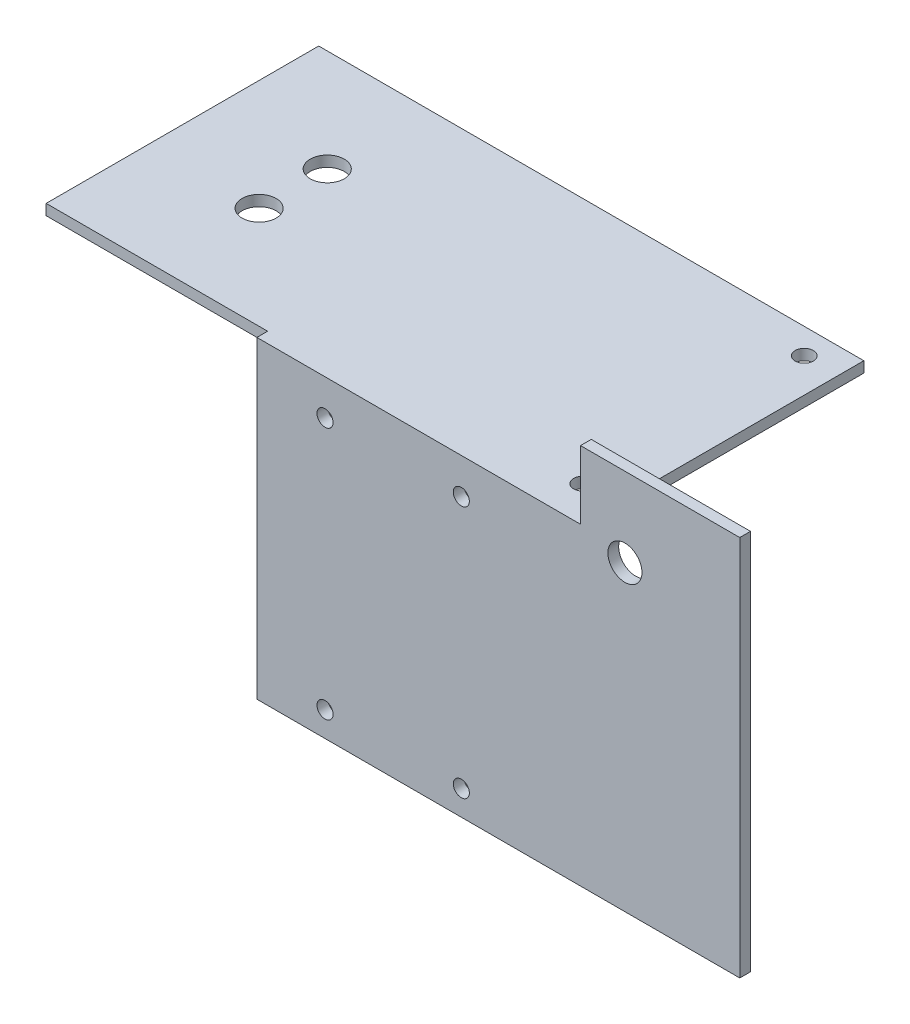
ISO-10303-21;
HEADER;
FILE_DESCRIPTION(('STEP AP214'),'2;1');
FILE_NAME('part.step','',(''),(''),'','','');
FILE_SCHEMA(('AUTOMOTIVE_DESIGN { 1 0 10303 214 1 1 1 1 }'));
ENDSEC;
DATA;
#1=APPLICATION_CONTEXT('core data for automotive mechanical design processes');
#2=APPLICATION_PROTOCOL_DEFINITION('international standard','automotive_design',2000,#1);
#3=PRODUCT_CONTEXT('',#1,'mechanical');
#4=PRODUCT('Part','Part','',(#3));
#5=PRODUCT_RELATED_PRODUCT_CATEGORY('part','',(#4));
#6=PRODUCT_DEFINITION_FORMATION('','',#4);
#7=PRODUCT_DEFINITION_CONTEXT('part definition',#1,'design');
#8=PRODUCT_DEFINITION('design','',#6,#7);
#9=PRODUCT_DEFINITION_SHAPE('','',#8);
#10=(LENGTH_UNIT() NAMED_UNIT(*) SI_UNIT(.MILLI.,.METRE.));
#11=(NAMED_UNIT(*) PLANE_ANGLE_UNIT() SI_UNIT($,.RADIAN.));
#12=(NAMED_UNIT(*) SI_UNIT($,.STERADIAN.) SOLID_ANGLE_UNIT());
#13=UNCERTAINTY_MEASURE_WITH_UNIT(LENGTH_MEASURE(1.E-05),#10,'distance_accuracy_value','');
#14=(GEOMETRIC_REPRESENTATION_CONTEXT(3) GLOBAL_UNCERTAINTY_ASSIGNED_CONTEXT((#13)) GLOBAL_UNIT_ASSIGNED_CONTEXT((#10,
#11,#12)) REPRESENTATION_CONTEXT('',''));
#15=CARTESIAN_POINT('',(0.,0.,0.));
#16=DIRECTION('',(0.,0.,1.));
#17=DIRECTION('',(1.,0.,0.));
#18=AXIS2_PLACEMENT_3D('',#15,#16,#17);
#19=CARTESIAN_POINT('',(0.,0.,-2.));
#20=DIRECTION('',(0.,0.,1.));
#21=DIRECTION('',(1.,0.,0.));
#22=AXIS2_PLACEMENT_3D('',#19,#20,#21);
#23=PLANE('',#22);
#24=CARTESIAN_POINT('',(68.6,56.33204182,-2.));
#25=DIRECTION('',(0.,0.,1.));
#26=DIRECTION('',(1.,0.,0.));
#27=AXIS2_PLACEMENT_3D('',#24,#25,#26);
#28=CIRCLE('',#27,3.175);
#29=CARTESIAN_POINT('',(71.775,56.33204182,-2.));
#30=VERTEX_POINT('',#29);
#31=EDGE_CURVE('E132',#30,#30,#28,.T.);
#32=ORIENTED_EDGE('',*,*,#31,.T.);
#33=EDGE_LOOP('',(#32));
#34=FACE_BOUND('',#33,.T.);
#35=CARTESIAN_POINT('',(12.7,51.75,-2.));
#36=DIRECTION('',(0.,0.,1.));
#37=DIRECTION('',(1.,0.,0.));
#38=AXIS2_PLACEMENT_3D('',#35,#36,#37);
#39=CIRCLE('',#38,1.5);
#40=CARTESIAN_POINT('',(14.2,51.75,-2.));
#41=VERTEX_POINT('',#40);
#42=EDGE_CURVE('E223',#41,#41,#39,.T.);
#43=ORIENTED_EDGE('',*,*,#42,.T.);
#44=EDGE_LOOP('',(#43));
#45=FACE_BOUND('',#44,.T.);
#46=CARTESIAN_POINT('',(38.1,51.75,-2.));
#47=DIRECTION('',(0.,0.,1.));
#48=DIRECTION('',(1.,0.,0.));
#49=AXIS2_PLACEMENT_3D('',#46,#47,#48);
#50=CIRCLE('',#49,1.5);
#51=CARTESIAN_POINT('',(39.6,51.75,-2.));
#52=VERTEX_POINT('',#51);
#53=EDGE_CURVE('E217',#52,#52,#50,.T.);
#54=ORIENTED_EDGE('',*,*,#53,.T.);
#55=EDGE_LOOP('',(#54));
#56=FACE_BOUND('',#55,.T.);
#57=CARTESIAN_POINT('',(12.7,4.64999999999999,-2.));
#58=DIRECTION('',(0.,0.,1.));
#59=DIRECTION('',(1.,0.,0.));
#60=AXIS2_PLACEMENT_3D('',#57,#58,#59);
#61=CIRCLE('',#60,1.5);
#62=CARTESIAN_POINT('',(14.2,4.64999999999999,-2.));
#63=VERTEX_POINT('',#62);
#64=EDGE_CURVE('E211',#63,#63,#61,.T.);
#65=ORIENTED_EDGE('',*,*,#64,.T.);
#66=EDGE_LOOP('',(#65));
#67=FACE_BOUND('',#66,.T.);
#68=CARTESIAN_POINT('',(38.1,4.64999999999999,-2.));
#69=DIRECTION('',(0.,0.,1.));
#70=DIRECTION('',(1.,0.,0.));
#71=AXIS2_PLACEMENT_3D('',#68,#69,#70);
#72=CIRCLE('',#71,1.50000000000002);
#73=CARTESIAN_POINT('',(39.6,4.64999999999999,-2.));
#74=VERTEX_POINT('',#73);
#75=EDGE_CURVE('E205',#74,#74,#72,.T.);
#76=ORIENTED_EDGE('',*,*,#75,.T.);
#77=EDGE_LOOP('',(#76));
#78=FACE_BOUND('',#77,.T.);
#79=DIRECTION('',(-1.,0.,0.));
#80=VECTOR('',#79,1.);
#81=CARTESIAN_POINT('',(0.,56.4,-2.));
#82=LINE('',#81,#80);
#83=CARTESIAN_POINT('',(60.325,56.4,-2.));
#84=VERTEX_POINT('',#83);
#85=CARTESIAN_POINT('',(0.,56.4,-2.));
#86=VERTEX_POINT('',#85);
#87=EDGE_CURVE('E189',#84,#86,#82,.T.);
#88=ORIENTED_EDGE('',*,*,#87,.F.);
#89=DIRECTION('',(0.,-1.,0.));
#90=VECTOR('',#89,1.);
#91=CARTESIAN_POINT('',(60.325,56.4,-2.));
#92=LINE('',#91,#90);
#93=CARTESIAN_POINT('',(60.325,58.4,-2.));
#94=VERTEX_POINT('',#93);
#95=EDGE_CURVE('E117',#94,#84,#92,.T.);
#96=ORIENTED_EDGE('',*,*,#95,.F.);
#97=DIRECTION('',(0.,-1.,0.));
#98=VECTOR('',#97,1.);
#99=CARTESIAN_POINT('',(60.325,58.4,-2.));
#100=LINE('',#99,#98);
#101=CARTESIAN_POINT('',(60.325,71.1,-2.));
#102=VERTEX_POINT('',#101);
#103=EDGE_CURVE('E102',#102,#94,#100,.T.);
#104=ORIENTED_EDGE('',*,*,#103,.F.);
#105=DIRECTION('',(-1.,0.,0.));
#106=VECTOR('',#105,1.);
#107=CARTESIAN_POINT('',(60.325,71.1,-2.));
#108=LINE('',#107,#106);
#109=CARTESIAN_POINT('',(90.,71.1,-2.));
#110=VERTEX_POINT('',#109);
#111=EDGE_CURVE('E114',#110,#102,#108,.T.);
#112=ORIENTED_EDGE('',*,*,#111,.F.);
#113=DIRECTION('',(0.,1.,0.));
#114=VECTOR('',#113,1.);
#115=CARTESIAN_POINT('',(90.,71.1,-2.));
#116=LINE('',#115,#114);
#117=CARTESIAN_POINT('',(90.,0.,-2.));
#118=VERTEX_POINT('',#117);
#119=EDGE_CURVE('E122',#118,#110,#116,.T.);
#120=ORIENTED_EDGE('',*,*,#119,.F.);
#121=DIRECTION('',(1.,0.,0.));
#122=VECTOR('',#121,1.);
#123=CARTESIAN_POINT('',(0.,0.,-2.));
#124=LINE('',#123,#122);
#125=CARTESIAN_POINT('',(0.,0.,-2.));
#126=VERTEX_POINT('',#125);
#127=EDGE_CURVE('E124',#126,#118,#124,.T.);
#128=ORIENTED_EDGE('',*,*,#127,.F.);
#129=DIRECTION('',(0.,-1.,0.));
#130=VECTOR('',#129,1.);
#131=CARTESIAN_POINT('',(0.,58.4,-2.));
#132=LINE('',#131,#130);
#133=EDGE_CURVE('E51',#86,#126,#132,.T.);
#134=ORIENTED_EDGE('',*,*,#133,.F.);
#135=EDGE_LOOP('',(#88,#96,#104,#112,#120,#128,#134));
#136=FACE_BOUND('',#135,.T.);
#137=ADVANCED_FACE('F34',(#34,#45,#56,#67,#78,#136),#23,.F.);
#138=CARTESIAN_POINT('',(0.,58.4,-2.));
#139=DIRECTION('',(-1.,0.,0.));
#140=DIRECTION('',(0.,0.,1.));
#141=AXIS2_PLACEMENT_3D('',#138,#139,#140);
#142=PLANE('',#141);
#143=DIRECTION('',(0.,-1.,0.));
#144=VECTOR('',#143,1.);
#145=CARTESIAN_POINT('',(0.,58.4,0.));
#146=LINE('',#145,#144);
#147=CARTESIAN_POINT('',(0.,58.4,0.));
#148=VERTEX_POINT('',#147);
#149=CARTESIAN_POINT('',(0.,0.,0.));
#150=VERTEX_POINT('',#149);
#151=EDGE_CURVE('E128',#148,#150,#146,.T.);
#152=ORIENTED_EDGE('',*,*,#151,.F.);
#153=DIRECTION('',(0.,0.,1.));
#154=VECTOR('',#153,1.);
#155=CARTESIAN_POINT('',(0.,58.4,-2.));
#156=LINE('',#155,#154);
#157=CARTESIAN_POINT('',(0.,58.4,-2.));
#158=VERTEX_POINT('',#157);
#159=EDGE_CURVE('E11',#158,#148,#156,.T.);
#160=ORIENTED_EDGE('',*,*,#159,.F.);
#161=EDGE_CURVE('E233',#158,#86,#132,.T.);
#162=ORIENTED_EDGE('',*,*,#161,.T.);
#163=ORIENTED_EDGE('',*,*,#133,.T.);
#164=DIRECTION('',(0.,0.,1.));
#165=VECTOR('',#164,1.);
#166=CARTESIAN_POINT('',(0.,0.,-2.));
#167=LINE('',#166,#165);
#168=EDGE_CURVE('E119',#126,#150,#167,.T.);
#169=ORIENTED_EDGE('',*,*,#168,.T.);
#170=EDGE_LOOP('',(#152,#160,#162,#163,#169));
#171=FACE_BOUND('',#170,.T.);
#172=ADVANCED_FACE('F36',(#171),#142,.T.);
#173=CARTESIAN_POINT('',(0.,58.4,-2.));
#174=DIRECTION('',(0.,1.,0.));
#175=DIRECTION('',(0.,0.,1.));
#176=AXIS2_PLACEMENT_3D('',#173,#174,#175);
#177=PLANE('',#176);
#178=CARTESIAN_POINT('',(53.975,58.4,-6.7625));
#179=DIRECTION('',(0.,1.,0.));
#180=DIRECTION('',(0.,0.,1.));
#181=AXIS2_PLACEMENT_3D('',#178,#179,#180);
#182=CIRCLE('',#181,1.7);
#183=CARTESIAN_POINT('',(53.975,58.4,-5.0625));
#184=VERTEX_POINT('',#183);
#185=EDGE_CURVE('E157',#184,#184,#182,.T.);
#186=ORIENTED_EDGE('',*,*,#185,.F.);
#187=EDGE_LOOP('',(#186));
#188=FACE_BOUND('',#187,.T.);
#189=CARTESIAN_POINT('',(-20.6375,58.4,-33.75));
#190=DIRECTION('',(0.,1.,0.));
#191=DIRECTION('',(0.,0.,1.));
#192=AXIS2_PLACEMENT_3D('',#189,#190,#191);
#193=CIRCLE('',#192,3.175);
#194=CARTESIAN_POINT('',(-20.6375,58.4,-30.575));
#195=VERTEX_POINT('',#194);
#196=EDGE_CURVE('E460',#195,#195,#193,.T.);
#197=ORIENTED_EDGE('',*,*,#196,.F.);
#198=EDGE_LOOP('',(#197));
#199=FACE_BOUND('',#198,.T.);
#200=CARTESIAN_POINT('',(-20.6375,58.4,-21.05));
#201=DIRECTION('',(0.,1.,0.));
#202=DIRECTION('',(0.,0.,1.));
#203=AXIS2_PLACEMENT_3D('',#200,#201,#202);
#204=CIRCLE('',#203,3.175);
#205=CARTESIAN_POINT('',(-20.6375,58.4,-17.875));
#206=VERTEX_POINT('',#205);
#207=EDGE_CURVE('E170',#206,#206,#204,.T.);
#208=ORIENTED_EDGE('',*,*,#207,.F.);
#209=EDGE_LOOP('',(#208));
#210=FACE_BOUND('',#209,.T.);
#211=CARTESIAN_POINT('',(53.975,58.4,-48.0375));
#212=DIRECTION('',(0.,1.,0.));
#213=DIRECTION('',(0.,0.,1.));
#214=AXIS2_PLACEMENT_3D('',#211,#212,#213);
#215=CIRCLE('',#214,1.7);
#216=CARTESIAN_POINT('',(53.975,58.4,-46.3375));
#217=VERTEX_POINT('',#216);
#218=EDGE_CURVE('E153',#217,#217,#215,.T.);
#219=ORIENTED_EDGE('',*,*,#218,.F.);
#220=EDGE_LOOP('',(#219));
#221=FACE_BOUND('',#220,.T.);
#222=DIRECTION('',(-1.,0.,0.));
#223=VECTOR('',#222,1.);
#224=CARTESIAN_POINT('',(0.,58.4,0.));
#225=LINE('',#224,#223);
#226=CARTESIAN_POINT('',(60.325,58.4,0.));
#227=VERTEX_POINT('',#226);
#228=EDGE_CURVE('E141',#227,#148,#225,.T.);
#229=ORIENTED_EDGE('',*,*,#228,.F.);
#230=DIRECTION('',(0.,0.,1.));
#231=VECTOR('',#230,1.);
#232=CARTESIAN_POINT('',(60.325,58.4,-2.));
#233=LINE('',#232,#231);
#234=EDGE_CURVE('E43',#94,#227,#233,.T.);
#235=ORIENTED_EDGE('',*,*,#234,.F.);
#236=DIRECTION('',(0.,0.,1.));
#237=VECTOR('',#236,1.);
#238=CARTESIAN_POINT('',(60.325,58.4,-52.8));
#239=LINE('',#238,#237);
#240=CARTESIAN_POINT('',(60.325,58.4,-52.8));
#241=VERTEX_POINT('',#240);
#242=EDGE_CURVE('E202',#241,#94,#239,.T.);
#243=ORIENTED_EDGE('',*,*,#242,.F.);
#244=DIRECTION('',(1.,0.,0.));
#245=VECTOR('',#244,1.);
#246=CARTESIAN_POINT('',(-41.275,58.4,-52.8));
#247=LINE('',#246,#245);
#248=CARTESIAN_POINT('',(-41.275,58.4,-52.8));
#249=VERTEX_POINT('',#248);
#250=EDGE_CURVE('E172',#249,#241,#247,.T.);
#251=ORIENTED_EDGE('',*,*,#250,.F.);
#252=DIRECTION('',(0.,0.,1.));
#253=VECTOR('',#252,1.);
#254=CARTESIAN_POINT('',(-41.275,58.4,-52.8));
#255=LINE('',#254,#253);
#256=CARTESIAN_POINT('',(-41.275,58.4,-2.));
#257=VERTEX_POINT('',#256);
#258=EDGE_CURVE('E185',#249,#257,#255,.T.);
#259=ORIENTED_EDGE('',*,*,#258,.T.);
#260=DIRECTION('',(1.,0.,0.));
#261=VECTOR('',#260,1.);
#262=CARTESIAN_POINT('',(60.325,58.4,-2.));
#263=LINE('',#262,#261);
#264=EDGE_CURVE('E152',#257,#158,#263,.T.);
#265=ORIENTED_EDGE('',*,*,#264,.T.);
#266=ORIENTED_EDGE('',*,*,#159,.T.);
#267=EDGE_LOOP('',(#229,#235,#243,#251,#259,#265,#266));
#268=FACE_BOUND('',#267,.T.);
#269=ADVANCED_FACE('F244',(#188,#199,#210,#221,#268),#177,.T.);
#270=CARTESIAN_POINT('',(60.325,58.4,-2.));
#271=DIRECTION('',(-1.,0.,0.));
#272=DIRECTION('',(0.,0.,1.));
#273=AXIS2_PLACEMENT_3D('',#270,#271,#272);
#274=PLANE('',#273);
#275=DIRECTION('',(0.,-1.,0.));
#276=VECTOR('',#275,1.);
#277=CARTESIAN_POINT('',(60.325,58.4,0.));
#278=LINE('',#277,#276);
#279=CARTESIAN_POINT('',(60.325,71.1,0.));
#280=VERTEX_POINT('',#279);
#281=EDGE_CURVE('E105',#280,#227,#278,.T.);
#282=ORIENTED_EDGE('',*,*,#281,.F.);
#283=DIRECTION('',(0.,0.,1.));
#284=VECTOR('',#283,1.);
#285=CARTESIAN_POINT('',(60.325,71.1,-2.));
#286=LINE('',#285,#284);
#287=EDGE_CURVE('E99',#102,#280,#286,.T.);
#288=ORIENTED_EDGE('',*,*,#287,.F.);
#289=ORIENTED_EDGE('',*,*,#103,.T.);
#290=ORIENTED_EDGE('',*,*,#234,.T.);
#291=EDGE_LOOP('',(#282,#288,#289,#290));
#292=FACE_BOUND('',#291,.T.);
#293=ADVANCED_FACE('F101',(#292),#274,.T.);
#294=CARTESIAN_POINT('',(60.325,71.1,-2.));
#295=DIRECTION('',(0.,1.,0.));
#296=DIRECTION('',(0.,0.,1.));
#297=AXIS2_PLACEMENT_3D('',#294,#295,#296);
#298=PLANE('',#297);
#299=DIRECTION('',(-1.,0.,0.));
#300=VECTOR('',#299,1.);
#301=CARTESIAN_POINT('',(60.325,71.1,0.));
#302=LINE('',#301,#300);
#303=CARTESIAN_POINT('',(90.,71.1,0.));
#304=VERTEX_POINT('',#303);
#305=EDGE_CURVE('E138',#304,#280,#302,.T.);
#306=ORIENTED_EDGE('',*,*,#305,.F.);
#307=DIRECTION('',(0.,0.,1.));
#308=VECTOR('',#307,1.);
#309=CARTESIAN_POINT('',(90.,71.1,-2.));
#310=LINE('',#309,#308);
#311=EDGE_CURVE('E110',#110,#304,#310,.T.);
#312=ORIENTED_EDGE('',*,*,#311,.F.);
#313=ORIENTED_EDGE('',*,*,#111,.T.);
#314=ORIENTED_EDGE('',*,*,#287,.T.);
#315=EDGE_LOOP('',(#306,#312,#313,#314));
#316=FACE_BOUND('',#315,.T.);
#317=ADVANCED_FACE('F121',(#316),#298,.T.);
#318=CARTESIAN_POINT('',(90.,71.1,-2.));
#319=DIRECTION('',(1.,0.,0.));
#320=DIRECTION('',(0.,1.,0.));
#321=AXIS2_PLACEMENT_3D('',#318,#319,#320);
#322=PLANE('',#321);
#323=DIRECTION('',(0.,1.,0.));
#324=VECTOR('',#323,1.);
#325=CARTESIAN_POINT('',(90.,71.1,0.));
#326=LINE('',#325,#324);
#327=CARTESIAN_POINT('',(90.,0.,0.));
#328=VERTEX_POINT('',#327);
#329=EDGE_CURVE('E135',#328,#304,#326,.T.);
#330=ORIENTED_EDGE('',*,*,#329,.F.);
#331=DIRECTION('',(0.,0.,1.));
#332=VECTOR('',#331,1.);
#333=CARTESIAN_POINT('',(90.,0.,-2.));
#334=LINE('',#333,#332);
#335=EDGE_CURVE('E146',#118,#328,#334,.T.);
#336=ORIENTED_EDGE('',*,*,#335,.F.);
#337=ORIENTED_EDGE('',*,*,#119,.T.);
#338=ORIENTED_EDGE('',*,*,#311,.T.);
#339=EDGE_LOOP('',(#330,#336,#337,#338));
#340=FACE_BOUND('',#339,.T.);
#341=ADVANCED_FACE('F240',(#340),#322,.T.);
#342=CARTESIAN_POINT('',(0.,0.,-2.));
#343=DIRECTION('',(0.,-1.,0.));
#344=DIRECTION('',(0.,0.,-1.));
#345=AXIS2_PLACEMENT_3D('',#342,#343,#344);
#346=PLANE('',#345);
#347=DIRECTION('',(1.,0.,0.));
#348=VECTOR('',#347,1.);
#349=CARTESIAN_POINT('',(0.,0.,0.));
#350=LINE('',#349,#348);
#351=EDGE_CURVE('E131',#150,#328,#350,.T.);
#352=ORIENTED_EDGE('',*,*,#351,.F.);
#353=ORIENTED_EDGE('',*,*,#168,.F.);
#354=ORIENTED_EDGE('',*,*,#127,.T.);
#355=ORIENTED_EDGE('',*,*,#335,.T.);
#356=EDGE_LOOP('',(#352,#353,#354,#355));
#357=FACE_BOUND('',#356,.T.);
#358=ADVANCED_FACE('F237',(#357),#346,.T.);
#359=CARTESIAN_POINT('',(0.,0.,0.));
#360=DIRECTION('',(0.,0.,1.));
#361=DIRECTION('',(1.,0.,0.));
#362=AXIS2_PLACEMENT_3D('',#359,#360,#361);
#363=PLANE('',#362);
#364=CARTESIAN_POINT('',(38.1,4.64999999999999,0.));
#365=DIRECTION('',(0.,0.,1.));
#366=DIRECTION('',(1.,0.,0.));
#367=AXIS2_PLACEMENT_3D('',#364,#365,#366);
#368=CIRCLE('',#367,1.50000000000002);
#369=CARTESIAN_POINT('',(39.6,4.64999999999999,0.));
#370=VERTEX_POINT('',#369);
#371=EDGE_CURVE('E204',#370,#370,#368,.T.);
#372=ORIENTED_EDGE('',*,*,#371,.F.);
#373=EDGE_LOOP('',(#372));
#374=FACE_BOUND('',#373,.T.);
#375=CARTESIAN_POINT('',(12.7,4.64999999999999,0.));
#376=DIRECTION('',(0.,0.,1.));
#377=DIRECTION('',(1.,0.,0.));
#378=AXIS2_PLACEMENT_3D('',#375,#376,#377);
#379=CIRCLE('',#378,1.5);
#380=CARTESIAN_POINT('',(14.2,4.64999999999999,0.));
#381=VERTEX_POINT('',#380);
#382=EDGE_CURVE('E208',#381,#381,#379,.T.);
#383=ORIENTED_EDGE('',*,*,#382,.F.);
#384=EDGE_LOOP('',(#383));
#385=FACE_BOUND('',#384,.T.);
#386=CARTESIAN_POINT('',(38.1,51.75,0.));
#387=DIRECTION('',(0.,0.,1.));
#388=DIRECTION('',(1.,0.,0.));
#389=AXIS2_PLACEMENT_3D('',#386,#387,#388);
#390=CIRCLE('',#389,1.5);
#391=CARTESIAN_POINT('',(39.6,51.75,0.));
#392=VERTEX_POINT('',#391);
#393=EDGE_CURVE('E214',#392,#392,#390,.T.);
#394=ORIENTED_EDGE('',*,*,#393,.F.);
#395=EDGE_LOOP('',(#394));
#396=FACE_BOUND('',#395,.T.);
#397=CARTESIAN_POINT('',(12.7,51.75,0.));
#398=DIRECTION('',(0.,0.,1.));
#399=DIRECTION('',(1.,0.,0.));
#400=AXIS2_PLACEMENT_3D('',#397,#398,#399);
#401=CIRCLE('',#400,1.5);
#402=CARTESIAN_POINT('',(14.2,51.75,0.));
#403=VERTEX_POINT('',#402);
#404=EDGE_CURVE('E220',#403,#403,#401,.T.);
#405=ORIENTED_EDGE('',*,*,#404,.F.);
#406=EDGE_LOOP('',(#405));
#407=FACE_BOUND('',#406,.T.);
#408=CARTESIAN_POINT('',(68.6,56.33204182,0.));
#409=DIRECTION('',(0.,0.,1.));
#410=DIRECTION('',(1.,0.,0.));
#411=AXIS2_PLACEMENT_3D('',#408,#409,#410);
#412=CIRCLE('',#411,3.175);
#413=CARTESIAN_POINT('',(71.775,56.33204182,0.));
#414=VERTEX_POINT('',#413);
#415=EDGE_CURVE('E226',#414,#414,#412,.T.);
#416=ORIENTED_EDGE('',*,*,#415,.F.);
#417=EDGE_LOOP('',(#416));
#418=FACE_BOUND('',#417,.T.);
#419=ORIENTED_EDGE('',*,*,#151,.T.);
#420=ORIENTED_EDGE('',*,*,#351,.T.);
#421=ORIENTED_EDGE('',*,*,#329,.T.);
#422=ORIENTED_EDGE('',*,*,#305,.T.);
#423=ORIENTED_EDGE('',*,*,#281,.T.);
#424=ORIENTED_EDGE('',*,*,#228,.T.);
#425=EDGE_LOOP('',(#419,#420,#421,#422,#423,#424));
#426=FACE_BOUND('',#425,.T.);
#427=ADVANCED_FACE('F242',(#374,#385,#396,#407,#418,#426),#363,.T.);
#428=CARTESIAN_POINT('',(68.6,56.33204182,-2.));
#429=DIRECTION('',(0.,0.,1.));
#430=DIRECTION('',(1.,0.,0.));
#431=AXIS2_PLACEMENT_3D('',#428,#429,#430);
#432=CYLINDRICAL_SURFACE('',#431,3.175);
#433=ORIENTED_EDGE('',*,*,#31,.F.);
#434=EDGE_LOOP('',(#433));
#435=FACE_BOUND('',#434,.T.);
#436=ORIENTED_EDGE('',*,*,#415,.T.);
#437=EDGE_LOOP('',(#436));
#438=FACE_BOUND('',#437,.T.);
#439=ADVANCED_FACE('F258',(#435,#438),#432,.F.);
#440=CARTESIAN_POINT('',(12.7,51.75,-2.));
#441=DIRECTION('',(0.,0.,1.));
#442=DIRECTION('',(1.,0.,0.));
#443=AXIS2_PLACEMENT_3D('',#440,#441,#442);
#444=CYLINDRICAL_SURFACE('',#443,1.5);
#445=ORIENTED_EDGE('',*,*,#42,.F.);
#446=EDGE_LOOP('',(#445));
#447=FACE_BOUND('',#446,.T.);
#448=ORIENTED_EDGE('',*,*,#404,.T.);
#449=EDGE_LOOP('',(#448));
#450=FACE_BOUND('',#449,.T.);
#451=ADVANCED_FACE('F283',(#447,#450),#444,.F.);
#452=CARTESIAN_POINT('',(38.1,51.75,-2.));
#453=DIRECTION('',(0.,0.,1.));
#454=DIRECTION('',(1.,0.,0.));
#455=AXIS2_PLACEMENT_3D('',#452,#453,#454);
#456=CYLINDRICAL_SURFACE('',#455,1.5);
#457=ORIENTED_EDGE('',*,*,#53,.F.);
#458=EDGE_LOOP('',(#457));
#459=FACE_BOUND('',#458,.T.);
#460=ORIENTED_EDGE('',*,*,#393,.T.);
#461=EDGE_LOOP('',(#460));
#462=FACE_BOUND('',#461,.T.);
#463=ADVANCED_FACE('F290',(#459,#462),#456,.F.);
#464=CARTESIAN_POINT('',(12.7,4.64999999999999,-2.));
#465=DIRECTION('',(0.,0.,1.));
#466=DIRECTION('',(1.,0.,0.));
#467=AXIS2_PLACEMENT_3D('',#464,#465,#466);
#468=CYLINDRICAL_SURFACE('',#467,1.5);
#469=ORIENTED_EDGE('',*,*,#64,.F.);
#470=EDGE_LOOP('',(#469));
#471=FACE_BOUND('',#470,.T.);
#472=ORIENTED_EDGE('',*,*,#382,.T.);
#473=EDGE_LOOP('',(#472));
#474=FACE_BOUND('',#473,.T.);
#475=ADVANCED_FACE('F297',(#471,#474),#468,.F.);
#476=CARTESIAN_POINT('',(38.1,4.64999999999999,-2.));
#477=DIRECTION('',(0.,0.,1.));
#478=DIRECTION('',(1.,0.,0.));
#479=AXIS2_PLACEMENT_3D('',#476,#477,#478);
#480=CYLINDRICAL_SURFACE('',#479,1.50000000000002);
#481=ORIENTED_EDGE('',*,*,#75,.F.);
#482=EDGE_LOOP('',(#481));
#483=FACE_BOUND('',#482,.T.);
#484=ORIENTED_EDGE('',*,*,#371,.T.);
#485=EDGE_LOOP('',(#484));
#486=FACE_BOUND('',#485,.T.);
#487=ADVANCED_FACE('F305',(#483,#486),#480,.F.);
#488=CARTESIAN_POINT('',(0.,0.,-2.));
#489=DIRECTION('',(0.,0.,1.));
#490=DIRECTION('',(1.,0.,0.));
#491=AXIS2_PLACEMENT_3D('',#488,#489,#490);
#492=PLANE('',#491);
#493=ORIENTED_EDGE('',*,*,#161,.F.);
#494=ORIENTED_EDGE('',*,*,#264,.F.);
#495=DIRECTION('',(0.,1.,0.));
#496=VECTOR('',#495,1.);
#497=CARTESIAN_POINT('',(-41.275,56.4,-2.));
#498=LINE('',#497,#496);
#499=CARTESIAN_POINT('',(-41.275,56.4,-2.));
#500=VERTEX_POINT('',#499);
#501=EDGE_CURVE('E176',#500,#257,#498,.T.);
#502=ORIENTED_EDGE('',*,*,#501,.F.);
#503=EDGE_CURVE('E188',#86,#500,#82,.T.);
#504=ORIENTED_EDGE('',*,*,#503,.F.);
#505=EDGE_LOOP('',(#493,#494,#502,#504));
#506=FACE_BOUND('',#505,.T.);
#507=ADVANCED_FACE('F313',(#506),#492,.T.);
#508=CARTESIAN_POINT('',(60.325,56.4,-52.8));
#509=DIRECTION('',(-1.,0.,0.));
#510=DIRECTION('',(0.,0.,1.));
#511=AXIS2_PLACEMENT_3D('',#508,#509,#510);
#512=PLANE('',#511);
#513=ORIENTED_EDGE('',*,*,#95,.T.);
#514=DIRECTION('',(0.,0.,1.));
#515=VECTOR('',#514,1.);
#516=CARTESIAN_POINT('',(60.325,56.4,-52.8));
#517=LINE('',#516,#515);
#518=CARTESIAN_POINT('',(60.325,56.4,-52.8));
#519=VERTEX_POINT('',#518);
#520=EDGE_CURVE('E199',#519,#84,#517,.T.);
#521=ORIENTED_EDGE('',*,*,#520,.F.);
#522=DIRECTION('',(0.,-1.,0.));
#523=VECTOR('',#522,1.);
#524=CARTESIAN_POINT('',(60.325,56.4,-52.8));
#525=LINE('',#524,#523);
#526=EDGE_CURVE('E175',#241,#519,#525,.T.);
#527=ORIENTED_EDGE('',*,*,#526,.F.);
#528=ORIENTED_EDGE('',*,*,#242,.T.);
#529=EDGE_LOOP('',(#513,#521,#527,#528));
#530=FACE_BOUND('',#529,.T.);
#531=ADVANCED_FACE('F321',(#530),#512,.F.);
#532=CARTESIAN_POINT('',(0.,56.4,-52.8));
#533=DIRECTION('',(0.,1.,0.));
#534=DIRECTION('',(0.,0.,1.));
#535=AXIS2_PLACEMENT_3D('',#532,#533,#534);
#536=PLANE('',#535);
#537=CARTESIAN_POINT('',(53.975,56.4,-6.7625));
#538=DIRECTION('',(0.,1.,0.));
#539=DIRECTION('',(0.,0.,1.));
#540=AXIS2_PLACEMENT_3D('',#537,#538,#539);
#541=CIRCLE('',#540,1.7);
#542=CARTESIAN_POINT('',(53.975,56.4,-5.0625));
#543=VERTEX_POINT('',#542);
#544=EDGE_CURVE('E38',#543,#543,#541,.T.);
#545=ORIENTED_EDGE('',*,*,#544,.T.);
#546=EDGE_LOOP('',(#545));
#547=FACE_BOUND('',#546,.T.);
#548=CARTESIAN_POINT('',(-20.6375,56.4,-33.75));
#549=DIRECTION('',(0.,1.,0.));
#550=DIRECTION('',(0.,0.,1.));
#551=AXIS2_PLACEMENT_3D('',#548,#549,#550);
#552=CIRCLE('',#551,3.175);
#553=CARTESIAN_POINT('',(-20.6375,56.4,-30.575));
#554=VERTEX_POINT('',#553);
#555=EDGE_CURVE('E156',#554,#554,#552,.T.);
#556=ORIENTED_EDGE('',*,*,#555,.T.);
#557=EDGE_LOOP('',(#556));
#558=FACE_BOUND('',#557,.T.);
#559=CARTESIAN_POINT('',(-20.6375,56.4,-21.05));
#560=DIRECTION('',(0.,1.,0.));
#561=DIRECTION('',(0.,0.,1.));
#562=AXIS2_PLACEMENT_3D('',#559,#560,#561);
#563=CIRCLE('',#562,3.175);
#564=CARTESIAN_POINT('',(-20.6375,56.4,-17.875));
#565=VERTEX_POINT('',#564);
#566=EDGE_CURVE('E154',#565,#565,#563,.T.);
#567=ORIENTED_EDGE('',*,*,#566,.T.);
#568=EDGE_LOOP('',(#567));
#569=FACE_BOUND('',#568,.T.);
#570=CARTESIAN_POINT('',(53.975,56.4,-48.0375));
#571=DIRECTION('',(0.,1.,0.));
#572=DIRECTION('',(0.,0.,1.));
#573=AXIS2_PLACEMENT_3D('',#570,#571,#572);
#574=CIRCLE('',#573,1.7);
#575=CARTESIAN_POINT('',(53.975,56.4,-46.3375));
#576=VERTEX_POINT('',#575);
#577=EDGE_CURVE('E149',#576,#576,#574,.T.);
#578=ORIENTED_EDGE('',*,*,#577,.T.);
#579=EDGE_LOOP('',(#578));
#580=FACE_BOUND('',#579,.T.);
#581=ORIENTED_EDGE('',*,*,#87,.T.);
#582=ORIENTED_EDGE('',*,*,#503,.T.);
#583=DIRECTION('',(0.,0.,1.));
#584=VECTOR('',#583,1.);
#585=CARTESIAN_POINT('',(-41.275,56.4,-52.8));
#586=LINE('',#585,#584);
#587=CARTESIAN_POINT('',(-41.275,56.4,-52.8));
#588=VERTEX_POINT('',#587);
#589=EDGE_CURVE('E196',#588,#500,#586,.T.);
#590=ORIENTED_EDGE('',*,*,#589,.F.);
#591=DIRECTION('',(-1.,0.,0.));
#592=VECTOR('',#591,1.);
#593=CARTESIAN_POINT('',(0.,56.4,-52.8));
#594=LINE('',#593,#592);
#595=EDGE_CURVE('E179',#519,#588,#594,.T.);
#596=ORIENTED_EDGE('',*,*,#595,.F.);
#597=ORIENTED_EDGE('',*,*,#520,.T.);
#598=EDGE_LOOP('',(#581,#582,#590,#596,#597));
#599=FACE_BOUND('',#598,.T.);
#600=ADVANCED_FACE('F330',(#547,#558,#569,#580,#599),#536,.F.);
#601=CARTESIAN_POINT('',(-41.275,56.4,-52.8));
#602=DIRECTION('',(1.,0.,0.));
#603=DIRECTION('',(0.,0.,-1.));
#604=AXIS2_PLACEMENT_3D('',#601,#602,#603);
#605=PLANE('',#604);
#606=ORIENTED_EDGE('',*,*,#501,.T.);
#607=ORIENTED_EDGE('',*,*,#258,.F.);
#608=DIRECTION('',(0.,1.,0.));
#609=VECTOR('',#608,1.);
#610=CARTESIAN_POINT('',(-41.275,56.4,-52.8));
#611=LINE('',#610,#609);
#612=EDGE_CURVE('E182',#588,#249,#611,.T.);
#613=ORIENTED_EDGE('',*,*,#612,.F.);
#614=ORIENTED_EDGE('',*,*,#589,.T.);
#615=EDGE_LOOP('',(#606,#607,#613,#614));
#616=FACE_BOUND('',#615,.T.);
#617=ADVANCED_FACE('F339',(#616),#605,.F.);
#618=CARTESIAN_POINT('',(0.,0.,-52.8));
#619=DIRECTION('',(0.,0.,1.));
#620=DIRECTION('',(1.,0.,0.));
#621=AXIS2_PLACEMENT_3D('',#618,#619,#620);
#622=PLANE('',#621);
#623=ORIENTED_EDGE('',*,*,#250,.T.);
#624=ORIENTED_EDGE('',*,*,#526,.T.);
#625=ORIENTED_EDGE('',*,*,#595,.T.);
#626=ORIENTED_EDGE('',*,*,#612,.T.);
#627=EDGE_LOOP('',(#623,#624,#625,#626));
#628=FACE_BOUND('',#627,.T.);
#629=ADVANCED_FACE('F347',(#628),#622,.F.);
#630=CARTESIAN_POINT('',(53.975,0.,-48.0375));
#631=DIRECTION('',(0.,1.,0.));
#632=DIRECTION('',(0.,0.,1.));
#633=AXIS2_PLACEMENT_3D('',#630,#631,#632);
#634=CYLINDRICAL_SURFACE('',#633,1.7);
#635=ORIENTED_EDGE('',*,*,#218,.T.);
#636=EDGE_LOOP('',(#635));
#637=FACE_BOUND('',#636,.T.);
#638=ORIENTED_EDGE('',*,*,#577,.F.);
#639=EDGE_LOOP('',(#638));
#640=FACE_BOUND('',#639,.T.);
#641=ADVANCED_FACE('F355',(#637,#640),#634,.F.);
#642=CARTESIAN_POINT('',(-20.6375,0.,-21.05));
#643=DIRECTION('',(0.,1.,0.));
#644=DIRECTION('',(0.,0.,1.));
#645=AXIS2_PLACEMENT_3D('',#642,#643,#644);
#646=CYLINDRICAL_SURFACE('',#645,3.175);
#647=ORIENTED_EDGE('',*,*,#207,.T.);
#648=EDGE_LOOP('',(#647));
#649=FACE_BOUND('',#648,.T.);
#650=ORIENTED_EDGE('',*,*,#566,.F.);
#651=EDGE_LOOP('',(#650));
#652=FACE_BOUND('',#651,.T.);
#653=ADVANCED_FACE('F362',(#649,#652),#646,.F.);
#654=CARTESIAN_POINT('',(-20.6375,0.,-33.75));
#655=DIRECTION('',(0.,1.,0.));
#656=DIRECTION('',(0.,0.,1.));
#657=AXIS2_PLACEMENT_3D('',#654,#655,#656);
#658=CYLINDRICAL_SURFACE('',#657,3.175);
#659=ORIENTED_EDGE('',*,*,#196,.T.);
#660=EDGE_LOOP('',(#659));
#661=FACE_BOUND('',#660,.T.);
#662=ORIENTED_EDGE('',*,*,#555,.F.);
#663=EDGE_LOOP('',(#662));
#664=FACE_BOUND('',#663,.T.);
#665=ADVANCED_FACE('F369',(#661,#664),#658,.F.);
#666=CARTESIAN_POINT('',(53.975,0.,-6.7625));
#667=DIRECTION('',(0.,1.,0.));
#668=DIRECTION('',(0.,0.,1.));
#669=AXIS2_PLACEMENT_3D('',#666,#667,#668);
#670=CYLINDRICAL_SURFACE('',#669,1.7);
#671=ORIENTED_EDGE('',*,*,#185,.T.);
#672=EDGE_LOOP('',(#671));
#673=FACE_BOUND('',#672,.T.);
#674=ORIENTED_EDGE('',*,*,#544,.F.);
#675=EDGE_LOOP('',(#674));
#676=FACE_BOUND('',#675,.T.);
#677=ADVANCED_FACE('F377',(#673,#676),#670,.F.);
#678=CLOSED_SHELL('',(#137,#172,#269,#293,#317,#341,#358,#427,#439,#451,#463,#475,#487,#507,
#531,#600,#617,#629,#641,#653,#665,#677));
#679=MANIFOLD_SOLID_BREP('B2',#678);
#680=ADVANCED_BREP_SHAPE_REPRESENTATION('',(#18,#679),#14);
#681=SHAPE_DEFINITION_REPRESENTATION(#9,#680);
ENDSEC;
END-ISO-10303-21;
